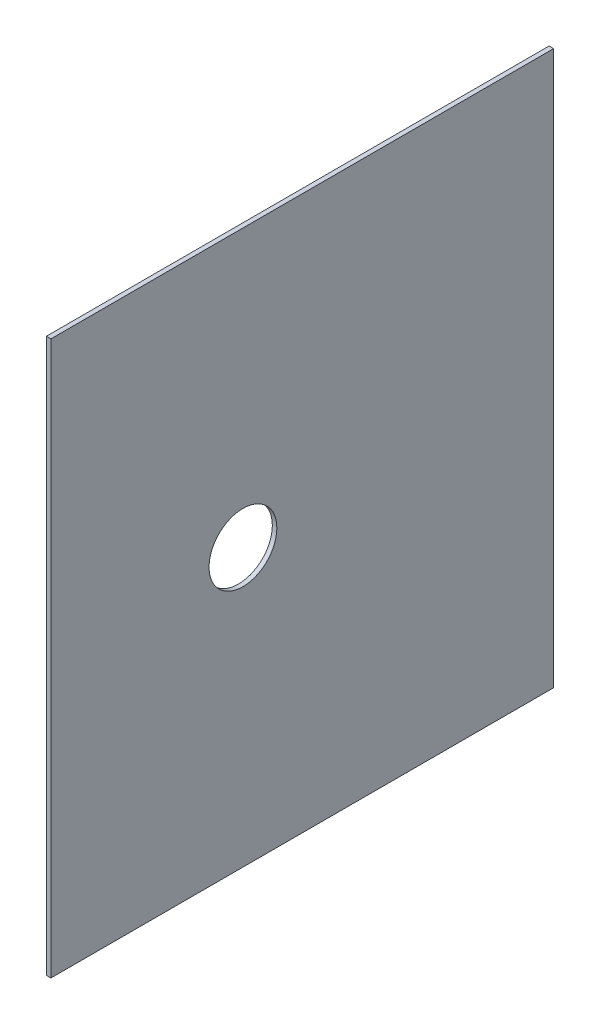
ISO-10303-21;
HEADER;
FILE_DESCRIPTION(('STEP AP214'),'2;1');
FILE_NAME('part.step','',(''),(''),'','','');
FILE_SCHEMA(('AUTOMOTIVE_DESIGN { 1 0 10303 214 1 1 1 1 }'));
ENDSEC;
DATA;
#1=APPLICATION_CONTEXT('core data for automotive mechanical design processes');
#2=APPLICATION_PROTOCOL_DEFINITION('international standard','automotive_design',2000,#1);
#3=PRODUCT_CONTEXT('',#1,'mechanical');
#4=PRODUCT('Part','Part','',(#3));
#5=PRODUCT_RELATED_PRODUCT_CATEGORY('part','',(#4));
#6=PRODUCT_DEFINITION_FORMATION('','',#4);
#7=PRODUCT_DEFINITION_CONTEXT('part definition',#1,'design');
#8=PRODUCT_DEFINITION('design','',#6,#7);
#9=PRODUCT_DEFINITION_SHAPE('','',#8);
#10=(LENGTH_UNIT() NAMED_UNIT(*) SI_UNIT(.MILLI.,.METRE.));
#11=(NAMED_UNIT(*) PLANE_ANGLE_UNIT() SI_UNIT($,.RADIAN.));
#12=(NAMED_UNIT(*) SI_UNIT($,.STERADIAN.) SOLID_ANGLE_UNIT());
#13=UNCERTAINTY_MEASURE_WITH_UNIT(LENGTH_MEASURE(1.E-05),#10,'distance_accuracy_value','');
#14=(GEOMETRIC_REPRESENTATION_CONTEXT(3) GLOBAL_UNCERTAINTY_ASSIGNED_CONTEXT((#13)) GLOBAL_UNIT_ASSIGNED_CONTEXT((#10,
#11,#12)) REPRESENTATION_CONTEXT('',''));
#15=CARTESIAN_POINT('',(0.,0.,0.));
#16=DIRECTION('',(0.,0.,1.));
#17=DIRECTION('',(1.,0.,0.));
#18=AXIS2_PLACEMENT_3D('',#15,#16,#17);
#19=CARTESIAN_POINT('',(4.,0.,0.));
#20=DIRECTION('',(-1.,0.,0.));
#21=DIRECTION('',(0.,0.,1.));
#22=AXIS2_PLACEMENT_3D('',#19,#20,#21);
#23=PLANE('',#22);
#24=DIRECTION('',(0.,-1.,0.));
#25=VECTOR('',#24,1.);
#26=CARTESIAN_POINT('',(4.,0.,0.));
#27=LINE('',#26,#25);
#28=CARTESIAN_POINT('',(4.,490.,0.));
#29=VERTEX_POINT('',#28);
#30=CARTESIAN_POINT('',(4.,0.,0.));
#31=VERTEX_POINT('',#30);
#32=EDGE_CURVE('E85',#29,#31,#27,.T.);
#33=ORIENTED_EDGE('',*,*,#32,.T.);
#34=DIRECTION('',(0.,0.,-1.));
#35=VECTOR('',#34,1.);
#36=CARTESIAN_POINT('',(4.,0.,0.));
#37=LINE('',#36,#35);
#38=CARTESIAN_POINT('',(4.,0.,-445.));
#39=VERTEX_POINT('',#38);
#40=EDGE_CURVE('E80',#31,#39,#37,.T.);
#41=ORIENTED_EDGE('',*,*,#40,.T.);
#42=DIRECTION('',(0.,1.,0.));
#43=VECTOR('',#42,1.);
#44=CARTESIAN_POINT('',(4.,0.,-445.));
#45=LINE('',#44,#43);
#46=CARTESIAN_POINT('',(4.,490.,-445.));
#47=VERTEX_POINT('',#46);
#48=EDGE_CURVE('E83',#39,#47,#45,.T.);
#49=ORIENTED_EDGE('',*,*,#48,.T.);
#50=DIRECTION('',(0.,0.,1.));
#51=VECTOR('',#50,1.);
#52=CARTESIAN_POINT('',(4.,490.,0.));
#53=LINE('',#52,#51);
#54=EDGE_CURVE('E50',#47,#29,#53,.T.);
#55=ORIENTED_EDGE('',*,*,#54,.T.);
#56=EDGE_LOOP('',(#33,#41,#49,#55));
#57=FACE_BOUND('',#56,.T.);
#58=CARTESIAN_POINT('',(4.,245.,-170.));
#59=DIRECTION('',(1.,0.,0.));
#60=DIRECTION('',(0.,0.,-1.));
#61=AXIS2_PLACEMENT_3D('',#58,#59,#60);
#62=CIRCLE('',#61,30.0000000000001);
#63=CARTESIAN_POINT('',(4.,245.,-200.));
#64=VERTEX_POINT('',#63);
#65=EDGE_CURVE('E100',#64,#64,#62,.T.);
#66=ORIENTED_EDGE('',*,*,#65,.F.);
#67=EDGE_LOOP('',(#66));
#68=FACE_BOUND('',#67,.T.);
#69=ADVANCED_FACE('F33',(#57,#68),#23,.F.);
#70=CARTESIAN_POINT('',(0.,0.,0.));
#71=DIRECTION('',(-1.,0.,0.));
#72=DIRECTION('',(0.,0.,1.));
#73=AXIS2_PLACEMENT_3D('',#70,#71,#72);
#74=PLANE('',#73);
#75=DIRECTION('',(0.,-1.,0.));
#76=VECTOR('',#75,1.);
#77=CARTESIAN_POINT('',(0.,0.,0.));
#78=LINE('',#77,#76);
#79=CARTESIAN_POINT('',(0.,490.,0.));
#80=VERTEX_POINT('',#79);
#81=CARTESIAN_POINT('',(0.,0.,0.));
#82=VERTEX_POINT('',#81);
#83=EDGE_CURVE('E97',#80,#82,#78,.T.);
#84=ORIENTED_EDGE('',*,*,#83,.F.);
#85=DIRECTION('',(0.,0.,1.));
#86=VECTOR('',#85,1.);
#87=CARTESIAN_POINT('',(0.,490.,0.));
#88=LINE('',#87,#86);
#89=CARTESIAN_POINT('',(0.,490.,-445.));
#90=VERTEX_POINT('',#89);
#91=EDGE_CURVE('E73',#90,#80,#88,.T.);
#92=ORIENTED_EDGE('',*,*,#91,.F.);
#93=DIRECTION('',(0.,1.,0.));
#94=VECTOR('',#93,1.);
#95=CARTESIAN_POINT('',(0.,0.,-445.));
#96=LINE('',#95,#94);
#97=CARTESIAN_POINT('',(0.,0.,-445.));
#98=VERTEX_POINT('',#97);
#99=EDGE_CURVE('E67',#98,#90,#96,.T.);
#100=ORIENTED_EDGE('',*,*,#99,.F.);
#101=DIRECTION('',(0.,0.,-1.));
#102=VECTOR('',#101,1.);
#103=CARTESIAN_POINT('',(0.,0.,0.));
#104=LINE('',#103,#102);
#105=EDGE_CURVE('E89',#82,#98,#104,.T.);
#106=ORIENTED_EDGE('',*,*,#105,.F.);
#107=EDGE_LOOP('',(#84,#92,#100,#106));
#108=FACE_BOUND('',#107,.T.);
#109=CARTESIAN_POINT('',(0.,245.,-170.));
#110=DIRECTION('',(1.,0.,0.));
#111=DIRECTION('',(0.,0.,-1.));
#112=AXIS2_PLACEMENT_3D('',#109,#110,#111);
#113=CIRCLE('',#112,30.0000000000001);
#114=CARTESIAN_POINT('',(0.,245.,-200.));
#115=VERTEX_POINT('',#114);
#116=EDGE_CURVE('E112',#115,#115,#113,.T.);
#117=ORIENTED_EDGE('',*,*,#116,.T.);
#118=EDGE_LOOP('',(#117));
#119=FACE_BOUND('',#118,.T.);
#120=ADVANCED_FACE('F108',(#108,#119),#74,.T.);
#121=CARTESIAN_POINT('',(4.,0.,0.));
#122=DIRECTION('',(0.,0.,-1.));
#123=DIRECTION('',(-1.,0.,0.));
#124=AXIS2_PLACEMENT_3D('',#121,#122,#123);
#125=PLANE('',#124);
#126=ORIENTED_EDGE('',*,*,#83,.T.);
#127=DIRECTION('',(-1.,0.,0.));
#128=VECTOR('',#127,1.);
#129=CARTESIAN_POINT('',(4.,0.,0.));
#130=LINE('',#129,#128);
#131=EDGE_CURVE('E11',#31,#82,#130,.T.);
#132=ORIENTED_EDGE('',*,*,#131,.F.);
#133=ORIENTED_EDGE('',*,*,#32,.F.);
#134=DIRECTION('',(-1.,0.,0.));
#135=VECTOR('',#134,1.);
#136=CARTESIAN_POINT('',(4.,490.,0.));
#137=LINE('',#136,#135);
#138=EDGE_CURVE('E93',#29,#80,#137,.T.);
#139=ORIENTED_EDGE('',*,*,#138,.T.);
#140=EDGE_LOOP('',(#126,#132,#133,#139));
#141=FACE_BOUND('',#140,.T.);
#142=ADVANCED_FACE('F35',(#141),#125,.F.);
#143=CARTESIAN_POINT('',(4.,0.,0.));
#144=DIRECTION('',(0.,1.,0.));
#145=DIRECTION('',(0.,0.,1.));
#146=AXIS2_PLACEMENT_3D('',#143,#144,#145);
#147=PLANE('',#146);
#148=ORIENTED_EDGE('',*,*,#105,.T.);
#149=DIRECTION('',(-1.,0.,0.));
#150=VECTOR('',#149,1.);
#151=CARTESIAN_POINT('',(4.,0.,-445.));
#152=LINE('',#151,#150);
#153=EDGE_CURVE('E42',#39,#98,#152,.T.);
#154=ORIENTED_EDGE('',*,*,#153,.F.);
#155=ORIENTED_EDGE('',*,*,#40,.F.);
#156=ORIENTED_EDGE('',*,*,#131,.T.);
#157=EDGE_LOOP('',(#148,#154,#155,#156));
#158=FACE_BOUND('',#157,.T.);
#159=ADVANCED_FACE('F88',(#158),#147,.F.);
#160=CARTESIAN_POINT('',(4.,0.,-445.));
#161=DIRECTION('',(0.,0.,1.));
#162=DIRECTION('',(1.,0.,0.));
#163=AXIS2_PLACEMENT_3D('',#160,#161,#162);
#164=PLANE('',#163);
#165=ORIENTED_EDGE('',*,*,#99,.T.);
#166=DIRECTION('',(-1.,0.,0.));
#167=VECTOR('',#166,1.);
#168=CARTESIAN_POINT('',(4.,490.,-445.));
#169=LINE('',#168,#167);
#170=EDGE_CURVE('E90',#47,#90,#169,.T.);
#171=ORIENTED_EDGE('',*,*,#170,.F.);
#172=ORIENTED_EDGE('',*,*,#48,.F.);
#173=ORIENTED_EDGE('',*,*,#153,.T.);
#174=EDGE_LOOP('',(#165,#171,#172,#173));
#175=FACE_BOUND('',#174,.T.);
#176=ADVANCED_FACE('F91',(#175),#164,.F.);
#177=CARTESIAN_POINT('',(4.,490.,0.));
#178=DIRECTION('',(0.,-1.,0.));
#179=DIRECTION('',(0.,0.,-1.));
#180=AXIS2_PLACEMENT_3D('',#177,#178,#179);
#181=PLANE('',#180);
#182=ORIENTED_EDGE('',*,*,#91,.T.);
#183=ORIENTED_EDGE('',*,*,#138,.F.);
#184=ORIENTED_EDGE('',*,*,#54,.F.);
#185=ORIENTED_EDGE('',*,*,#170,.T.);
#186=EDGE_LOOP('',(#182,#183,#184,#185));
#187=FACE_BOUND('',#186,.T.);
#188=ADVANCED_FACE('F105',(#187),#181,.F.);
#189=CARTESIAN_POINT('',(4.,245.,-170.));
#190=DIRECTION('',(-1.,0.,0.));
#191=DIRECTION('',(0.,0.,1.));
#192=AXIS2_PLACEMENT_3D('',#189,#190,#191);
#193=CYLINDRICAL_SURFACE('',#192,30.0000000000001);
#194=ORIENTED_EDGE('',*,*,#65,.T.);
#195=EDGE_LOOP('',(#194));
#196=FACE_BOUND('',#195,.T.);
#197=ORIENTED_EDGE('',*,*,#116,.F.);
#198=EDGE_LOOP('',(#197));
#199=FACE_BOUND('',#198,.T.);
#200=ADVANCED_FACE('F118',(#196,#199),#193,.F.);
#201=CLOSED_SHELL('',(#69,#120,#142,#159,#176,#188,#200));
#202=MANIFOLD_SOLID_BREP('B2',#201);
#203=ADVANCED_BREP_SHAPE_REPRESENTATION('',(#18,#202),#14);
#204=SHAPE_DEFINITION_REPRESENTATION(#9,#203);
ENDSEC;
END-ISO-10303-21;
